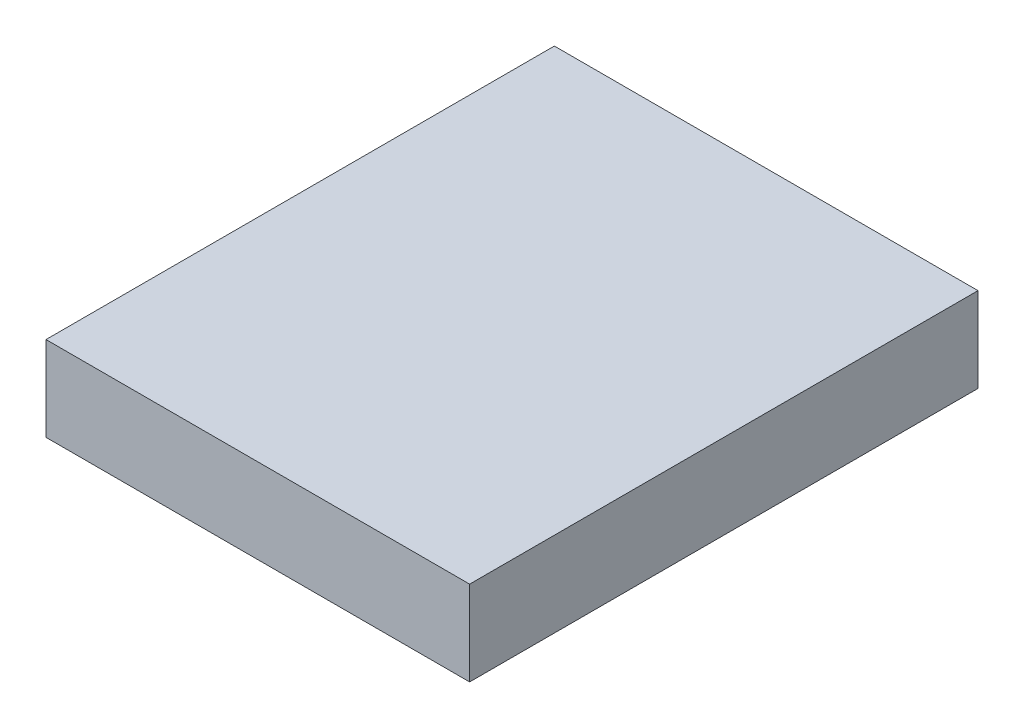
ISO-10303-21;
HEADER;
FILE_DESCRIPTION(('STEP AP214'),'2;1');
FILE_NAME('part.step','',(''),(''),'','','');
FILE_SCHEMA(('AUTOMOTIVE_DESIGN { 1 0 10303 214 1 1 1 1 }'));
ENDSEC;
DATA;
#1=APPLICATION_CONTEXT('core data for automotive mechanical design processes');
#2=APPLICATION_PROTOCOL_DEFINITION('international standard','automotive_design',2000,#1);
#3=PRODUCT_CONTEXT('',#1,'mechanical');
#4=PRODUCT('Part','Part','',(#3));
#5=PRODUCT_RELATED_PRODUCT_CATEGORY('part','',(#4));
#6=PRODUCT_DEFINITION_FORMATION('','',#4);
#7=PRODUCT_DEFINITION_CONTEXT('part definition',#1,'design');
#8=PRODUCT_DEFINITION('design','',#6,#7);
#9=PRODUCT_DEFINITION_SHAPE('','',#8);
#10=(LENGTH_UNIT() NAMED_UNIT(*) SI_UNIT(.MILLI.,.METRE.));
#11=(NAMED_UNIT(*) PLANE_ANGLE_UNIT() SI_UNIT($,.RADIAN.));
#12=(NAMED_UNIT(*) SI_UNIT($,.STERADIAN.) SOLID_ANGLE_UNIT());
#13=UNCERTAINTY_MEASURE_WITH_UNIT(LENGTH_MEASURE(1.E-05),#10,'distance_accuracy_value','');
#14=(GEOMETRIC_REPRESENTATION_CONTEXT(3) GLOBAL_UNCERTAINTY_ASSIGNED_CONTEXT((#13)) GLOBAL_UNIT_ASSIGNED_CONTEXT((#10,
#11,#12)) REPRESENTATION_CONTEXT('',''));
#15=CARTESIAN_POINT('',(0.,0.,0.));
#16=DIRECTION('',(0.,0.,1.));
#17=DIRECTION('',(1.,0.,0.));
#18=AXIS2_PLACEMENT_3D('',#15,#16,#17);
#19=CARTESIAN_POINT('',(50.,-10.,120.));
#20=DIRECTION('',(-1.,0.,0.));
#21=DIRECTION('',(0.,0.,1.));
#22=AXIS2_PLACEMENT_3D('',#19,#20,#21);
#23=PLANE('',#22);
#24=DIRECTION('',(0.,1.,0.));
#25=VECTOR('',#24,1.);
#26=CARTESIAN_POINT('',(50.,-10.,0.));
#27=LINE('',#26,#25);
#28=CARTESIAN_POINT('',(50.,-10.,0.));
#29=VERTEX_POINT('',#28);
#30=CARTESIAN_POINT('',(50.,10.,0.));
#31=VERTEX_POINT('',#30);
#32=EDGE_CURVE('E105',#29,#31,#27,.T.);
#33=ORIENTED_EDGE('',*,*,#32,.T.);
#34=DIRECTION('',(0.,0.,-1.));
#35=VECTOR('',#34,1.);
#36=CARTESIAN_POINT('',(50.,10.,120.));
#37=LINE('',#36,#35);
#38=CARTESIAN_POINT('',(50.,10.,120.));
#39=VERTEX_POINT('',#38);
#40=EDGE_CURVE('E11',#39,#31,#37,.T.);
#41=ORIENTED_EDGE('',*,*,#40,.F.);
#42=DIRECTION('',(0.,1.,0.));
#43=VECTOR('',#42,1.);
#44=CARTESIAN_POINT('',(50.,-10.,120.));
#45=LINE('',#44,#43);
#46=CARTESIAN_POINT('',(50.,-10.,120.));
#47=VERTEX_POINT('',#46);
#48=EDGE_CURVE('E89',#47,#39,#45,.T.);
#49=ORIENTED_EDGE('',*,*,#48,.F.);
#50=DIRECTION('',(0.,0.,-1.));
#51=VECTOR('',#50,1.);
#52=CARTESIAN_POINT('',(50.,-10.,120.));
#53=LINE('',#52,#51);
#54=EDGE_CURVE('E98',#47,#29,#53,.T.);
#55=ORIENTED_EDGE('',*,*,#54,.T.);
#56=EDGE_LOOP('',(#33,#41,#49,#55));
#57=FACE_BOUND('',#56,.T.);
#58=ADVANCED_FACE('F39',(#57),#23,.F.);
#59=CARTESIAN_POINT('',(-50.,10.,120.));
#60=DIRECTION('',(0.,-1.,0.));
#61=DIRECTION('',(0.,0.,-1.));
#62=AXIS2_PLACEMENT_3D('',#59,#60,#61);
#63=PLANE('',#62);
#64=DIRECTION('',(-1.,0.,0.));
#65=VECTOR('',#64,1.);
#66=CARTESIAN_POINT('',(-50.,10.,0.));
#67=LINE('',#66,#65);
#68=CARTESIAN_POINT('',(-50.,10.,0.));
#69=VERTEX_POINT('',#68);
#70=EDGE_CURVE('E94',#31,#69,#67,.T.);
#71=ORIENTED_EDGE('',*,*,#70,.T.);
#72=DIRECTION('',(0.,0.,-1.));
#73=VECTOR('',#72,1.);
#74=CARTESIAN_POINT('',(-50.,10.,120.));
#75=LINE('',#74,#73);
#76=CARTESIAN_POINT('',(-50.,10.,120.));
#77=VERTEX_POINT('',#76);
#78=EDGE_CURVE('E50',#77,#69,#75,.T.);
#79=ORIENTED_EDGE('',*,*,#78,.F.);
#80=DIRECTION('',(-1.,0.,0.));
#81=VECTOR('',#80,1.);
#82=CARTESIAN_POINT('',(-50.,10.,120.));
#83=LINE('',#82,#81);
#84=EDGE_CURVE('E84',#39,#77,#83,.T.);
#85=ORIENTED_EDGE('',*,*,#84,.F.);
#86=ORIENTED_EDGE('',*,*,#40,.T.);
#87=EDGE_LOOP('',(#71,#79,#85,#86));
#88=FACE_BOUND('',#87,.T.);
#89=ADVANCED_FACE('F91',(#88),#63,.F.);
#90=CARTESIAN_POINT('',(-50.,-10.,120.));
#91=DIRECTION('',(1.,0.,0.));
#92=DIRECTION('',(0.,0.,-1.));
#93=AXIS2_PLACEMENT_3D('',#90,#91,#92);
#94=PLANE('',#93);
#95=DIRECTION('',(0.,-1.,0.));
#96=VECTOR('',#95,1.);
#97=CARTESIAN_POINT('',(-50.,-10.,0.));
#98=LINE('',#97,#96);
#99=CARTESIAN_POINT('',(-50.,-10.,0.));
#100=VERTEX_POINT('',#99);
#101=EDGE_CURVE('E75',#69,#100,#98,.T.);
#102=ORIENTED_EDGE('',*,*,#101,.T.);
#103=DIRECTION('',(0.,0.,-1.));
#104=VECTOR('',#103,1.);
#105=CARTESIAN_POINT('',(-50.,-10.,120.));
#106=LINE('',#105,#104);
#107=CARTESIAN_POINT('',(-50.,-10.,120.));
#108=VERTEX_POINT('',#107);
#109=EDGE_CURVE('E92',#108,#100,#106,.T.);
#110=ORIENTED_EDGE('',*,*,#109,.F.);
#111=DIRECTION('',(0.,-1.,0.));
#112=VECTOR('',#111,1.);
#113=CARTESIAN_POINT('',(-50.,-10.,120.));
#114=LINE('',#113,#112);
#115=EDGE_CURVE('E86',#77,#108,#114,.T.);
#116=ORIENTED_EDGE('',*,*,#115,.F.);
#117=ORIENTED_EDGE('',*,*,#78,.T.);
#118=EDGE_LOOP('',(#102,#110,#116,#117));
#119=FACE_BOUND('',#118,.T.);
#120=ADVANCED_FACE('F96',(#119),#94,.F.);
#121=CARTESIAN_POINT('',(-50.,-10.,120.));
#122=DIRECTION('',(0.,1.,0.));
#123=DIRECTION('',(-1.,0.,0.));
#124=AXIS2_PLACEMENT_3D('',#121,#122,#123);
#125=PLANE('',#124);
#126=DIRECTION('',(1.,0.,0.));
#127=VECTOR('',#126,1.);
#128=CARTESIAN_POINT('',(-50.,-10.,0.));
#129=LINE('',#128,#127);
#130=EDGE_CURVE('E79',#100,#29,#129,.T.);
#131=ORIENTED_EDGE('',*,*,#130,.T.);
#132=ORIENTED_EDGE('',*,*,#54,.F.);
#133=DIRECTION('',(1.,0.,0.));
#134=VECTOR('',#133,1.);
#135=CARTESIAN_POINT('',(-50.,-10.,120.));
#136=LINE('',#135,#134);
#137=EDGE_CURVE('E54',#108,#47,#136,.T.);
#138=ORIENTED_EDGE('',*,*,#137,.F.);
#139=ORIENTED_EDGE('',*,*,#109,.T.);
#140=EDGE_LOOP('',(#131,#132,#138,#139));
#141=FACE_BOUND('',#140,.T.);
#142=ADVANCED_FACE('F108',(#141),#125,.F.);
#143=CARTESIAN_POINT('',(0.,0.,120.));
#144=DIRECTION('',(0.,0.,-1.));
#145=DIRECTION('',(-1.,0.,0.));
#146=AXIS2_PLACEMENT_3D('',#143,#144,#145);
#147=PLANE('',#146);
#148=ORIENTED_EDGE('',*,*,#48,.T.);
#149=ORIENTED_EDGE('',*,*,#84,.T.);
#150=ORIENTED_EDGE('',*,*,#115,.T.);
#151=ORIENTED_EDGE('',*,*,#137,.T.);
#152=EDGE_LOOP('',(#148,#149,#150,#151));
#153=FACE_BOUND('',#152,.T.);
#154=ADVANCED_FACE('F88',(#153),#147,.F.);
#155=CARTESIAN_POINT('',(0.,0.,0.));
#156=DIRECTION('',(0.,0.,-1.));
#157=DIRECTION('',(-1.,0.,0.));
#158=AXIS2_PLACEMENT_3D('',#155,#156,#157);
#159=PLANE('',#158);
#160=ORIENTED_EDGE('',*,*,#32,.F.);
#161=ORIENTED_EDGE('',*,*,#130,.F.);
#162=ORIENTED_EDGE('',*,*,#101,.F.);
#163=ORIENTED_EDGE('',*,*,#70,.F.);
#164=EDGE_LOOP('',(#160,#161,#162,#163));
#165=FACE_BOUND('',#164,.T.);
#166=ADVANCED_FACE('F115',(#165),#159,.T.);
#167=CLOSED_SHELL('',(#58,#89,#120,#142,#154,#166));
#168=MANIFOLD_SOLID_BREP('B2',#167);
#169=ADVANCED_BREP_SHAPE_REPRESENTATION('',(#18,#168),#14);
#170=SHAPE_DEFINITION_REPRESENTATION(#9,#169);
ENDSEC;
END-ISO-10303-21;
